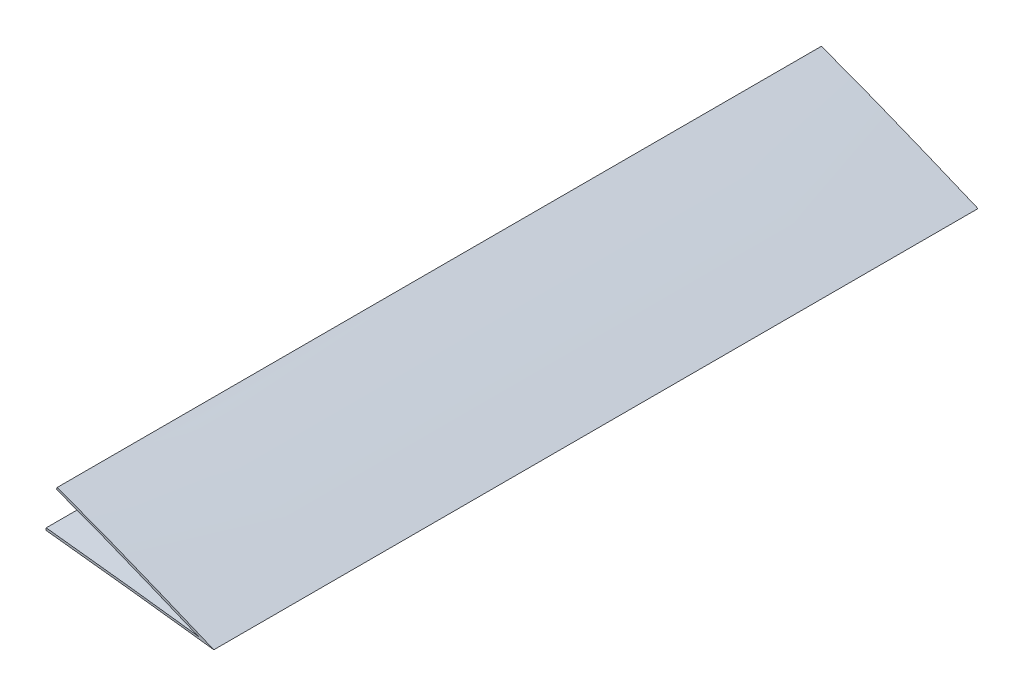
ISO-10303-21;
HEADER;
FILE_DESCRIPTION(('STEP AP214'),'2;1');
FILE_NAME('part.step','',(''),(''),'','','');
FILE_SCHEMA(('AUTOMOTIVE_DESIGN { 1 0 10303 214 1 1 1 1 }'));
ENDSEC;
DATA;
#1=APPLICATION_CONTEXT('core data for automotive mechanical design processes');
#2=APPLICATION_PROTOCOL_DEFINITION('international standard','automotive_design',2000,#1);
#3=PRODUCT_CONTEXT('',#1,'mechanical');
#4=PRODUCT('Part','Part','',(#3));
#5=PRODUCT_RELATED_PRODUCT_CATEGORY('part','',(#4));
#6=PRODUCT_DEFINITION_FORMATION('','',#4);
#7=PRODUCT_DEFINITION_CONTEXT('part definition',#1,'design');
#8=PRODUCT_DEFINITION('design','',#6,#7);
#9=PRODUCT_DEFINITION_SHAPE('','',#8);
#10=(LENGTH_UNIT() NAMED_UNIT(*) SI_UNIT(.MILLI.,.METRE.));
#11=(NAMED_UNIT(*) PLANE_ANGLE_UNIT() SI_UNIT($,.RADIAN.));
#12=(NAMED_UNIT(*) SI_UNIT($,.STERADIAN.) SOLID_ANGLE_UNIT());
#13=UNCERTAINTY_MEASURE_WITH_UNIT(LENGTH_MEASURE(1.E-05),#10,'distance_accuracy_value','');
#14=(GEOMETRIC_REPRESENTATION_CONTEXT(3) GLOBAL_UNCERTAINTY_ASSIGNED_CONTEXT((#13)) GLOBAL_UNIT_ASSIGNED_CONTEXT((#10,
#11,#12)) REPRESENTATION_CONTEXT('',''));
#15=CARTESIAN_POINT('',(0.,0.,0.));
#16=DIRECTION('',(0.,0.,1.));
#17=DIRECTION('',(1.,0.,0.));
#18=AXIS2_PLACEMENT_3D('',#15,#16,#17);
#19=CARTESIAN_POINT('',(1988.02305883041,2944.18599810179,-174.625));
#20=CARTESIAN_POINT('',(1988.4860936965,2944.14044059067,-174.625));
#21=CARTESIAN_POINT('',(1990.11861976774,2943.97758883364,-174.625));
#22=CARTESIAN_POINT('',(1992.87856538639,2943.65192778852,-174.625));
#23=CARTESIAN_POINT('',(1996.26056182215,2943.27824299011,-174.625));
#24=CARTESIAN_POINT('',(1999.50276368961,2942.88136099166,-174.625));
#25=CARTESIAN_POINT('',(2002.59505450618,2942.58817036161,-174.625));
#26=CARTESIAN_POINT('',(2005.51427925806,2942.19869931625,-174.625));
#27=CARTESIAN_POINT('',(2008.28630101592,2941.92861298624,-174.625));
#28=CARTESIAN_POINT('',(2010.88552648472,2941.56905741507,-174.625));
#29=CARTESIAN_POINT('',(2013.3339009843,2941.29983663925,-174.625));
#30=CARTESIAN_POINT('',(2015.60789868894,2941.03328103495,-174.625));
#31=CARTESIAN_POINT('',(2017.70584724161,2940.75505034335,-174.625));
#32=CARTESIAN_POINT('',(2019.62940298667,2940.57851809757,-174.625));
#33=CARTESIAN_POINT('',(2021.36766207254,2940.31482751687,-174.625));
#34=CARTESIAN_POINT('',(2022.93120368427,2940.14747141157,-174.625));
#35=CARTESIAN_POINT('',(2024.3197481941,2939.97788358142,-174.625));
#36=CARTESIAN_POINT('',(2025.44054917517,2939.81131808059,-174.625));
#37=CARTESIAN_POINT('',(2026.11368253309,2939.75555714232,-174.625));
#38=CARTESIAN_POINT('',(2026.37812322283,2939.72601974893,-174.625));
#39=B_SPLINE_CURVE_WITH_KNOTS('',3,(#19,#20,#21,#22,#23,#24,#25,#26,#27,#28,#29,#30,#31,#32,#33,
#34,#35,#36,#37,#38),.UNSPECIFIED.,.F.,.F.,(4,1,1,1,1,1,1,1,1,1,1,1,1,1,1,1,1,4),
(28.4329806907909,28.4879334748767,28.6267563678009,28.7612032643811,28.8898159231674,
29.0125341125278,29.1280218659914,29.2376094309799,29.3414338076934,29.4378933017833,
29.5285192075717,29.6118543910173,29.6878305241122,29.7565901692537,29.819438039544,
29.8735369008995,29.9218053046442,29.9532403861273),.UNSPECIFIED.);
#40=DIRECTION('',(0.,0.,1.));
#41=VECTOR('',#40,1.);
#42=SURFACE_OF_LINEAR_EXTRUSION('',#39,#41);
#43=CARTESIAN_POINT('',(1988.02305883041,2944.18599810179,0.));
#44=CARTESIAN_POINT('',(1988.4860936965,2944.14044059067,0.));
#45=CARTESIAN_POINT('',(1990.11861976774,2943.97758883364,0.));
#46=CARTESIAN_POINT('',(1992.87856538639,2943.65192778852,0.));
#47=CARTESIAN_POINT('',(1996.26056182215,2943.27824299011,0.));
#48=CARTESIAN_POINT('',(1999.50276368961,2942.88136099166,0.));
#49=CARTESIAN_POINT('',(2002.59505450618,2942.58817036161,0.));
#50=CARTESIAN_POINT('',(2005.51427925806,2942.19869931625,0.));
#51=CARTESIAN_POINT('',(2008.28630101592,2941.92861298624,0.));
#52=CARTESIAN_POINT('',(2010.88552648472,2941.56905741507,0.));
#53=CARTESIAN_POINT('',(2013.3339009843,2941.29983663925,0.));
#54=CARTESIAN_POINT('',(2015.60789868894,2941.03328103495,0.));
#55=CARTESIAN_POINT('',(2017.70584724161,2940.75505034335,0.));
#56=CARTESIAN_POINT('',(2019.62940298667,2940.57851809757,0.));
#57=CARTESIAN_POINT('',(2021.36766207254,2940.31482751687,0.));
#58=CARTESIAN_POINT('',(2022.93120368427,2940.14747141157,0.));
#59=CARTESIAN_POINT('',(2024.3197481941,2939.97788358142,0.));
#60=CARTESIAN_POINT('',(2025.44054917517,2939.81131808059,0.));
#61=CARTESIAN_POINT('',(2026.11368253309,2939.75555714232,0.));
#62=CARTESIAN_POINT('',(2026.37812322283,2939.72601974893,0.));
#63=B_SPLINE_CURVE_WITH_KNOTS('',3,(#43,#44,#45,#46,#47,#48,#49,#50,#51,#52,#53,#54,#55,#56,#57,
#58,#59,#60,#61,#62),.UNSPECIFIED.,.F.,.F.,(4,1,1,1,1,1,1,1,1,1,1,1,1,1,1,1,1,4),
(28.4329806907909,28.4879334748767,28.6267563678009,28.7612032643811,28.8898159231674,
29.0125341125278,29.1280218659914,29.2376094309799,29.3414338076934,29.4378933017833,
29.5285192075717,29.6118543910173,29.6878305241122,29.7565901692537,29.819438039544,
29.8735369008995,29.9218053046442,29.9532403861273),.UNSPECIFIED.);
#64=CARTESIAN_POINT('',(1988.02305883041,2944.18599810179,0.));
#65=VERTEX_POINT('',#64);
#66=CARTESIAN_POINT('',(2026.37812322283,2939.72601974893,0.));
#67=VERTEX_POINT('',#66);
#68=EDGE_CURVE('E170',#65,#67,#63,.T.);
#69=ORIENTED_EDGE('',*,*,#68,.F.);
#70=DIRECTION('',(0.,0.,1.));
#71=VECTOR('',#70,1.);
#72=CARTESIAN_POINT('',(1988.02305883041,2944.18599810179,-174.625));
#73=LINE('',#72,#71);
#74=CARTESIAN_POINT('',(1988.02305883041,2944.18599810179,-174.625));
#75=VERTEX_POINT('',#74);
#76=EDGE_CURVE('E159',#75,#65,#73,.T.);
#77=ORIENTED_EDGE('',*,*,#76,.F.);
#78=CARTESIAN_POINT('',(2026.37812322283,2939.72601974893,-174.625));
#79=VERTEX_POINT('',#78);
#80=EDGE_CURVE('E139',#75,#79,#39,.T.);
#81=ORIENTED_EDGE('',*,*,#80,.T.);
#82=DIRECTION('',(0.,0.,1.));
#83=VECTOR('',#82,1.);
#84=CARTESIAN_POINT('',(2026.37812322283,2939.72601974893,-174.625));
#85=LINE('',#84,#83);
#86=EDGE_CURVE('E11',#79,#67,#85,.T.);
#87=ORIENTED_EDGE('',*,*,#86,.T.);
#88=EDGE_LOOP('',(#69,#77,#81,#87));
#89=FACE_BOUND('',#88,.T.);
#90=ADVANCED_FACE('F34',(#89),#42,.T.);
#91=CARTESIAN_POINT('',(2026.37812322283,2939.72601974893,-174.625));
#92=CARTESIAN_POINT('',(2025.7723670329,2939.96681770488,-174.625));
#93=CARTESIAN_POINT('',(2025.16700119327,2940.20806577561,-174.625));
#94=CARTESIAN_POINT('',(2024.56327016065,2940.45119895005,-174.625));
#95=CARTESIAN_POINT('',(2024.25244988756,2940.57637177635,-174.625));
#96=CARTESIAN_POINT('',(2023.94206292393,2940.70204425383,-174.625));
#97=CARTESIAN_POINT('',(2023.63227908525,2940.82841219755,-174.625));
#98=CARTESIAN_POINT('',(2019.92290730254,2942.34155015426,-174.625));
#99=CARTESIAN_POINT('',(2016.30001050763,2943.95440282884,-174.625));
#100=CARTESIAN_POINT('',(2008.84038212805,2946.88486291156,-174.625));
#101=CARTESIAN_POINT('',(2005.18204635352,2948.44600331714,-174.625));
#102=CARTESIAN_POINT('',(1998.49830218971,2950.9925617946,-174.625));
#103=CARTESIAN_POINT('',(1995.57534901207,2952.14370847279,-174.625));
#104=CARTESIAN_POINT('',(1991.93586782327,2953.47362866195,-174.625));
#105=CARTESIAN_POINT('',(1991.26652278171,2953.72164072025,-174.625));
#106=CARTESIAN_POINT('',(1990.59802874074,2953.97095841238,-174.625));
#107=B_SPLINE_CURVE_WITH_KNOTS('',3,(#91,#92,#93,#94,#95,#96,#97,#98,#99,#100,#101,#102,#103,
#104,#105,#106),.UNSPECIFIED.,.F.,.F.,(4,3,3,2,2,2,4),(0.099020879068913,0.175577173941332,
0.214990831999981,0.686932530696415,1.15887422939285,1.53165502309098,1.61589570104789),.UNSPECIFIED.);
#108=DIRECTION('',(0.,0.,1.));
#109=VECTOR('',#108,1.);
#110=SURFACE_OF_LINEAR_EXTRUSION('',#107,#109);
#111=CARTESIAN_POINT('',(2026.37812322283,2939.72601974893,0.));
#112=CARTESIAN_POINT('',(2025.7723670329,2939.96681770488,0.));
#113=CARTESIAN_POINT('',(2025.16700119327,2940.20806577561,0.));
#114=CARTESIAN_POINT('',(2024.56327016065,2940.45119895005,0.));
#115=CARTESIAN_POINT('',(2024.25244988756,2940.57637177635,0.));
#116=CARTESIAN_POINT('',(2023.94206292393,2940.70204425383,0.));
#117=CARTESIAN_POINT('',(2023.63227908525,2940.82841219755,0.));
#118=CARTESIAN_POINT('',(2019.92290730254,2942.34155015426,0.));
#119=CARTESIAN_POINT('',(2016.30001050763,2943.95440282884,0.));
#120=CARTESIAN_POINT('',(2008.84038212805,2946.88486291156,0.));
#121=CARTESIAN_POINT('',(2005.18204635352,2948.44600331714,0.));
#122=CARTESIAN_POINT('',(1998.49830218971,2950.9925617946,0.));
#123=CARTESIAN_POINT('',(1995.57534901207,2952.14370847279,0.));
#124=CARTESIAN_POINT('',(1991.93586782327,2953.47362866195,0.));
#125=CARTESIAN_POINT('',(1991.26652278171,2953.72164072025,0.));
#126=CARTESIAN_POINT('',(1990.59802874074,2953.97095841238,0.));
#127=B_SPLINE_CURVE_WITH_KNOTS('',3,(#111,#112,#113,#114,#115,#116,#117,#118,#119,#120,#121,
#122,#123,#124,#125,#126),.UNSPECIFIED.,.F.,.F.,(4,3,3,2,2,2,4),(0.099020879068913,
0.175577173941332,0.214990831999981,0.686932530696415,1.15887422939285,1.53165502309098,
1.61589570104789),.UNSPECIFIED.);
#128=CARTESIAN_POINT('',(1990.59802874074,2953.97095841238,0.));
#129=VERTEX_POINT('',#128);
#130=EDGE_CURVE('E165',#67,#129,#127,.T.);
#131=ORIENTED_EDGE('',*,*,#130,.F.);
#132=ORIENTED_EDGE('',*,*,#86,.F.);
#133=CARTESIAN_POINT('',(1990.59802874074,2953.97095841238,-174.625));
#134=VERTEX_POINT('',#133);
#135=EDGE_CURVE('E83',#79,#134,#107,.T.);
#136=ORIENTED_EDGE('',*,*,#135,.T.);
#137=DIRECTION('',(0.,0.,1.));
#138=VECTOR('',#137,1.);
#139=CARTESIAN_POINT('',(1990.59802874074,2953.97095841238,-174.625));
#140=LINE('',#139,#138);
#141=EDGE_CURVE('E43',#134,#129,#140,.T.);
#142=ORIENTED_EDGE('',*,*,#141,.T.);
#143=EDGE_LOOP('',(#131,#132,#136,#142));
#144=FACE_BOUND('',#143,.T.);
#145=ADVANCED_FACE('F132',(#144),#110,.T.);
#146=CARTESIAN_POINT('',(1990.42148669339,2953.49755342874,-174.625));
#147=DIRECTION('',(0.936968441110629,-0.349413995659473,0.));
#148=DIRECTION('',(0.349413995659473,0.936968441110629,0.));
#149=AXIS2_PLACEMENT_3D('',#146,#147,#148);
#150=PLANE('',#149);
#151=DIRECTION('',(-0.349413995659473,-0.936968441110629,0.));
#152=VECTOR('',#151,1.);
#153=CARTESIAN_POINT('',(1990.42148669339,2953.49755342874,0.));
#154=LINE('',#153,#152);
#155=CARTESIAN_POINT('',(1990.42148669339,2953.49755342874,0.));
#156=VERTEX_POINT('',#155);
#157=EDGE_CURVE('E168',#129,#156,#154,.T.);
#158=ORIENTED_EDGE('',*,*,#157,.F.);
#159=ORIENTED_EDGE('',*,*,#141,.F.);
#160=DIRECTION('',(-0.349413995659473,-0.936968441110629,0.));
#161=VECTOR('',#160,1.);
#162=CARTESIAN_POINT('',(1990.42148669339,2953.49755342874,-174.625));
#163=LINE('',#162,#161);
#164=CARTESIAN_POINT('',(1990.42148669339,2953.49755342874,-174.625));
#165=VERTEX_POINT('',#164);
#166=EDGE_CURVE('E111',#134,#165,#163,.T.);
#167=ORIENTED_EDGE('',*,*,#166,.T.);
#168=DIRECTION('',(0.,0.,1.));
#169=VECTOR('',#168,1.);
#170=CARTESIAN_POINT('',(1990.42148669339,2953.49755342874,-174.625));
#171=LINE('',#170,#169);
#172=EDGE_CURVE('E105',#165,#156,#171,.T.);
#173=ORIENTED_EDGE('',*,*,#172,.T.);
#174=EDGE_LOOP('',(#158,#159,#167,#173));
#175=FACE_BOUND('',#174,.T.);
#176=ADVANCED_FACE('F129',(#175),#150,.F.);
#177=CARTESIAN_POINT('',(1990.42148669339,2953.49755342874,-174.625));
#178=CARTESIAN_POINT('',(1991.26608646929,2953.18432727958,-174.625));
#179=CARTESIAN_POINT('',(1992.11061416994,2952.87083292376,-174.625));
#180=CARTESIAN_POINT('',(1997.44616335028,2950.89237515585,-174.625));
#181=CARTESIAN_POINT('',(2001.86633493205,2949.19683033505,-174.625));
#182=CARTESIAN_POINT('',(2010.80211572768,2945.57558877682,-174.625));
#183=CARTESIAN_POINT('',(2015.21732369742,2943.78783922893,-174.625));
#184=CARTESIAN_POINT('',(2020.71630821281,2941.50699908588,-174.625));
#185=CARTESIAN_POINT('',(2021.79802890697,2941.06151206462,-174.625));
#186=CARTESIAN_POINT('',(2022.86646084304,2940.6145709774,-174.625));
#187=B_SPLINE_CURVE_WITH_KNOTS('',3,(#177,#178,#179,#180,#181,#182,#183,#184,#185,#186),
.UNSPECIFIED.,.F.,.F.,(4,2,2,2,4),(0.2403730921367,0.346917733175911,0.913321397798007,
1.4797250624201,1.6161767153474),.UNSPECIFIED.);
#188=DIRECTION('',(0.,0.,1.));
#189=VECTOR('',#188,1.);
#190=SURFACE_OF_LINEAR_EXTRUSION('',#187,#189);
#191=CARTESIAN_POINT('',(1990.42148669339,2953.49755342874,0.));
#192=CARTESIAN_POINT('',(1991.26608646929,2953.18432727958,0.));
#193=CARTESIAN_POINT('',(1992.11061416994,2952.87083292376,0.));
#194=CARTESIAN_POINT('',(1997.44616335028,2950.89237515585,0.));
#195=CARTESIAN_POINT('',(2001.86633493205,2949.19683033505,0.));
#196=CARTESIAN_POINT('',(2010.80211572768,2945.57558877682,0.));
#197=CARTESIAN_POINT('',(2015.21732369742,2943.78783922893,0.));
#198=CARTESIAN_POINT('',(2020.71630821281,2941.50699908588,0.));
#199=CARTESIAN_POINT('',(2021.79802890697,2941.06151206462,0.));
#200=CARTESIAN_POINT('',(2022.86646084304,2940.6145709774,0.));
#201=B_SPLINE_CURVE_WITH_KNOTS('',3,(#191,#192,#193,#194,#195,#196,#197,#198,#199,#200),
.UNSPECIFIED.,.F.,.F.,(4,2,2,2,4),(0.2403730921367,0.346917733175911,0.913321397798007,
1.4797250624201,1.6161767153474),.UNSPECIFIED.);
#202=CARTESIAN_POINT('',(2022.86646084304,2940.6145709774,0.));
#203=VERTEX_POINT('',#202);
#204=EDGE_CURVE('E153',#156,#203,#201,.T.);
#205=ORIENTED_EDGE('',*,*,#204,.F.);
#206=ORIENTED_EDGE('',*,*,#172,.F.);
#207=CARTESIAN_POINT('',(2022.86646084304,2940.6145709774,-174.625));
#208=VERTEX_POINT('',#207);
#209=EDGE_CURVE('E95',#165,#208,#187,.T.);
#210=ORIENTED_EDGE('',*,*,#209,.T.);
#211=DIRECTION('',(0.,0.,1.));
#212=VECTOR('',#211,1.);
#213=CARTESIAN_POINT('',(2022.86646084304,2940.6145709774,-174.625));
#214=LINE('',#213,#212);
#215=EDGE_CURVE('E100',#208,#203,#214,.T.);
#216=ORIENTED_EDGE('',*,*,#215,.T.);
#217=EDGE_LOOP('',(#205,#206,#210,#216));
#218=FACE_BOUND('',#217,.T.);
#219=ADVANCED_FACE('F108',(#218),#190,.T.);
#220=CARTESIAN_POINT('',(2022.86646084304,2940.6145709774,-174.625));
#221=CARTESIAN_POINT('',(2018.88458440234,2941.06761583129,-174.625));
#222=CARTESIAN_POINT('',(2014.99093126998,2941.58752498364,-174.625));
#223=CARTESIAN_POINT('',(2004.5956555186,2942.86683582677,-174.625));
#224=CARTESIAN_POINT('',(1998.05216280753,2943.57578634532,-174.625));
#225=CARTESIAN_POINT('',(1990.38562197459,2944.45341124992,-174.625));
#226=CARTESIAN_POINT('',(1989.23015051689,2944.58289678001,-174.625));
#227=CARTESIAN_POINT('',(1988.07460597749,2944.70991009258,-174.625));
#228=B_SPLINE_CURVE_WITH_KNOTS('',3,(#220,#221,#222,#223,#224,#225,#226,#227),.UNSPECIFIED.,.F.,
.F.,(4,2,2,4),(28.432746501601,28.9032200601273,29.6765714038467,29.8138144101908),.UNSPECIFIED.);
#229=DIRECTION('',(0.,0.,1.));
#230=VECTOR('',#229,1.);
#231=SURFACE_OF_LINEAR_EXTRUSION('',#228,#230);
#232=CARTESIAN_POINT('',(2022.86646084304,2940.6145709774,0.));
#233=CARTESIAN_POINT('',(2018.88458440234,2941.06761583129,0.));
#234=CARTESIAN_POINT('',(2014.99093126998,2941.58752498364,0.));
#235=CARTESIAN_POINT('',(2004.5956555186,2942.86683582677,0.));
#236=CARTESIAN_POINT('',(1998.05216280753,2943.57578634532,0.));
#237=CARTESIAN_POINT('',(1990.38562197459,2944.45341124992,0.));
#238=CARTESIAN_POINT('',(1989.23015051689,2944.58289678001,0.));
#239=CARTESIAN_POINT('',(1988.07460597749,2944.70991009258,0.));
#240=B_SPLINE_CURVE_WITH_KNOTS('',3,(#232,#233,#234,#235,#236,#237,#238,#239),.UNSPECIFIED.,.F.,
.F.,(4,2,2,4),(28.432746501601,28.9032200601273,29.6765714038467,29.8138144101908),.UNSPECIFIED.);
#241=CARTESIAN_POINT('',(1988.07460597749,2944.70991009258,0.));
#242=VERTEX_POINT('',#241);
#243=EDGE_CURVE('E102',#203,#242,#240,.T.);
#244=ORIENTED_EDGE('',*,*,#243,.F.);
#245=ORIENTED_EDGE('',*,*,#215,.F.);
#246=CARTESIAN_POINT('',(1988.07460597749,2944.70991009258,-174.625));
#247=VERTEX_POINT('',#246);
#248=EDGE_CURVE('E91',#208,#247,#228,.T.);
#249=ORIENTED_EDGE('',*,*,#248,.T.);
#250=DIRECTION('',(0.,0.,1.));
#251=VECTOR('',#250,1.);
#252=CARTESIAN_POINT('',(1988.07460597749,2944.70991009258,-174.625));
#253=LINE('',#252,#251);
#254=EDGE_CURVE('E106',#247,#242,#253,.T.);
#255=ORIENTED_EDGE('',*,*,#254,.T.);
#256=EDGE_LOOP('',(#244,#245,#249,#255));
#257=FACE_BOUND('',#256,.T.);
#258=ADVANCED_FACE('F101',(#257),#231,.T.);
#259=CARTESIAN_POINT('',(1988.07460597749,2944.70991009258,-174.625));
#260=DIRECTION('',(0.995194668018483,-0.0979161516174972,0.));
#261=DIRECTION('',(0.0979161516174972,0.995194668018483,0.));
#262=AXIS2_PLACEMENT_3D('',#259,#260,#261);
#263=PLANE('',#262);
#264=DIRECTION('',(-0.0979161516174972,-0.995194668018483,0.));
#265=VECTOR('',#264,1.);
#266=CARTESIAN_POINT('',(1988.07460597749,2944.70991009258,0.));
#267=LINE('',#266,#265);
#268=EDGE_CURVE('E71',#242,#65,#267,.T.);
#269=ORIENTED_EDGE('',*,*,#268,.F.);
#270=ORIENTED_EDGE('',*,*,#254,.F.);
#271=DIRECTION('',(-0.0979161516174972,-0.995194668018483,0.));
#272=VECTOR('',#271,1.);
#273=CARTESIAN_POINT('',(1988.07460597749,2944.70991009258,-174.625));
#274=LINE('',#273,#272);
#275=EDGE_CURVE('E51',#247,#75,#274,.T.);
#276=ORIENTED_EDGE('',*,*,#275,.T.);
#277=ORIENTED_EDGE('',*,*,#76,.T.);
#278=EDGE_LOOP('',(#269,#270,#276,#277));
#279=FACE_BOUND('',#278,.T.);
#280=ADVANCED_FACE('F189',(#279),#263,.F.);
#281=CARTESIAN_POINT('',(2007.20939270748,2942.03057340049,-174.625));
#282=DIRECTION('',(0.,0.,-1.));
#283=DIRECTION('',(1.,0.,0.));
#284=AXIS2_PLACEMENT_3D('',#281,#282,#283);
#285=PLANE('',#284);
#286=ORIENTED_EDGE('',*,*,#80,.F.);
#287=ORIENTED_EDGE('',*,*,#275,.F.);
#288=ORIENTED_EDGE('',*,*,#248,.F.);
#289=ORIENTED_EDGE('',*,*,#209,.F.);
#290=ORIENTED_EDGE('',*,*,#166,.F.);
#291=ORIENTED_EDGE('',*,*,#135,.F.);
#292=EDGE_LOOP('',(#286,#287,#288,#289,#290,#291));
#293=FACE_BOUND('',#292,.T.);
#294=ADVANCED_FACE('F93',(#293),#285,.T.);
#295=CARTESIAN_POINT('',(2007.20939270748,2942.03057340049,0.));
#296=DIRECTION('',(0.,0.,-1.));
#297=DIRECTION('',(1.,0.,0.));
#298=AXIS2_PLACEMENT_3D('',#295,#296,#297);
#299=PLANE('',#298);
#300=ORIENTED_EDGE('',*,*,#68,.T.);
#301=ORIENTED_EDGE('',*,*,#130,.T.);
#302=ORIENTED_EDGE('',*,*,#157,.T.);
#303=ORIENTED_EDGE('',*,*,#204,.T.);
#304=ORIENTED_EDGE('',*,*,#243,.T.);
#305=ORIENTED_EDGE('',*,*,#268,.T.);
#306=EDGE_LOOP('',(#300,#301,#302,#303,#304,#305));
#307=FACE_BOUND('',#306,.T.);
#308=ADVANCED_FACE('F167',(#307),#299,.F.);
#309=CLOSED_SHELL('',(#90,#145,#176,#219,#258,#280,#294,#308));
#310=MANIFOLD_SOLID_BREP('B2',#309);
#311=ADVANCED_BREP_SHAPE_REPRESENTATION('',(#18,#310),#14);
#312=SHAPE_DEFINITION_REPRESENTATION(#9,#311);
ENDSEC;
END-ISO-10303-21;
